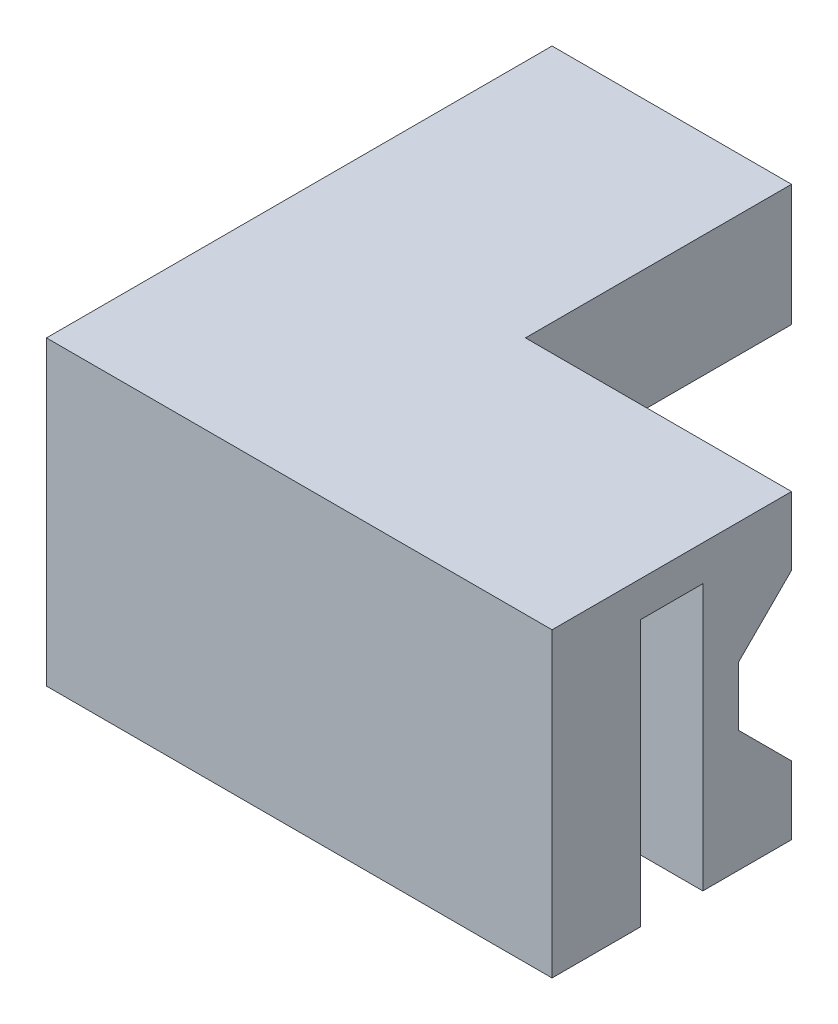
ISO-10303-21;
HEADER;
FILE_DESCRIPTION(('STEP AP214'),'2;1');
FILE_NAME('part.step','',(''),(''),'','','');
FILE_SCHEMA(('AUTOMOTIVE_DESIGN { 1 0 10303 214 1 1 1 1 }'));
ENDSEC;
DATA;
#1=APPLICATION_CONTEXT('core data for automotive mechanical design processes');
#2=APPLICATION_PROTOCOL_DEFINITION('international standard','automotive_design',2000,#1);
#3=PRODUCT_CONTEXT('',#1,'mechanical');
#4=PRODUCT('Part','Part','',(#3));
#5=PRODUCT_RELATED_PRODUCT_CATEGORY('part','',(#4));
#6=PRODUCT_DEFINITION_FORMATION('','',#4);
#7=PRODUCT_DEFINITION_CONTEXT('part definition',#1,'design');
#8=PRODUCT_DEFINITION('design','',#6,#7);
#9=PRODUCT_DEFINITION_SHAPE('','',#8);
#10=(LENGTH_UNIT() NAMED_UNIT(*) SI_UNIT(.MILLI.,.METRE.));
#11=(NAMED_UNIT(*) PLANE_ANGLE_UNIT() SI_UNIT($,.RADIAN.));
#12=(NAMED_UNIT(*) SI_UNIT($,.STERADIAN.) SOLID_ANGLE_UNIT());
#13=UNCERTAINTY_MEASURE_WITH_UNIT(LENGTH_MEASURE(1.E-05),#10,'distance_accuracy_value','');
#14=(GEOMETRIC_REPRESENTATION_CONTEXT(3) GLOBAL_UNCERTAINTY_ASSIGNED_CONTEXT((#13)) GLOBAL_UNIT_ASSIGNED_CONTEXT((#10,
#11,#12)) REPRESENTATION_CONTEXT('',''));
#15=CARTESIAN_POINT('',(0.,0.,0.));
#16=DIRECTION('',(0.,0.,1.));
#17=DIRECTION('',(1.,0.,0.));
#18=AXIS2_PLACEMENT_3D('',#15,#16,#17);
#19=CARTESIAN_POINT('',(-30.,0.,0.));
#20=DIRECTION('',(0.,-1.,0.));
#21=DIRECTION('',(0.,0.,-1.));
#22=AXIS2_PLACEMENT_3D('',#19,#20,#21);
#23=PLANE('',#22);
#24=DIRECTION('',(0.,0.,-1.));
#25=VECTOR('',#24,1.);
#26=CARTESIAN_POINT('',(-48.5,0.,-18.5));
#27=LINE('',#26,#25);
#28=CARTESIAN_POINT('',(-48.5,0.,0.));
#29=VERTEX_POINT('',#28);
#30=CARTESIAN_POINT('',(-48.5,0.,-23.5));
#31=VERTEX_POINT('',#30);
#32=EDGE_CURVE('E257',#29,#31,#27,.T.);
#33=ORIENTED_EDGE('',*,*,#32,.F.);
#34=DIRECTION('',(-1.,0.,0.));
#35=VECTOR('',#34,1.);
#36=CARTESIAN_POINT('',(-48.5,0.,0.));
#37=LINE('',#36,#35);
#38=CARTESIAN_POINT('',(-25.,0.,0.));
#39=VERTEX_POINT('',#38);
#40=EDGE_CURVE('E237',#39,#29,#37,.T.);
#41=ORIENTED_EDGE('',*,*,#40,.F.);
#42=DIRECTION('',(0.,0.,1.));
#43=VECTOR('',#42,1.);
#44=CARTESIAN_POINT('',(-25.,0.,5.));
#45=LINE('',#44,#43);
#46=CARTESIAN_POINT('',(-25.,0.,5.));
#47=VERTEX_POINT('',#46);
#48=EDGE_CURVE('E274',#39,#47,#45,.T.);
#49=ORIENTED_EDGE('',*,*,#48,.T.);
#50=DIRECTION('',(-1.,0.,0.));
#51=VECTOR('',#50,1.);
#52=CARTESIAN_POINT('',(-53.5,0.,5.));
#53=LINE('',#52,#51);
#54=CARTESIAN_POINT('',(-53.5,0.,5.));
#55=VERTEX_POINT('',#54);
#56=EDGE_CURVE('E278',#47,#55,#53,.T.);
#57=ORIENTED_EDGE('',*,*,#56,.T.);
#58=DIRECTION('',(0.,0.,-1.));
#59=VECTOR('',#58,1.);
#60=CARTESIAN_POINT('',(-53.5,0.,-23.5));
#61=LINE('',#60,#59);
#62=CARTESIAN_POINT('',(-53.5,0.,-23.5));
#63=VERTEX_POINT('',#62);
#64=EDGE_CURVE('E282',#55,#63,#61,.T.);
#65=ORIENTED_EDGE('',*,*,#64,.T.);
#66=DIRECTION('',(1.,0.,0.));
#67=VECTOR('',#66,1.);
#68=CARTESIAN_POINT('',(-40.,0.,-23.5));
#69=LINE('',#68,#67);
#70=EDGE_CURVE('E286',#63,#31,#69,.T.);
#71=ORIENTED_EDGE('',*,*,#70,.T.);
#72=EDGE_LOOP('',(#33,#41,#49,#57,#65,#71));
#73=FACE_BOUND('',#72,.T.);
#74=ADVANCED_FACE('F42',(#73),#23,.T.);
#75=CARTESIAN_POINT('',(-25.,15.,-8.5));
#76=DIRECTION('',(0.,0.,1.));
#77=DIRECTION('',(-1.,0.,0.));
#78=AXIS2_PLACEMENT_3D('',#75,#76,#77);
#79=PLANE('',#78);
#80=DIRECTION('',(0.,-1.,0.));
#81=VECTOR('',#80,1.);
#82=CARTESIAN_POINT('',(-40.,15.,-8.5));
#83=LINE('',#82,#81);
#84=CARTESIAN_POINT('',(-40.,17.,-8.5));
#85=VERTEX_POINT('',#84);
#86=CARTESIAN_POINT('',(-40.,13.15,-8.5));
#87=VERTEX_POINT('',#86);
#88=EDGE_CURVE('E186',#85,#87,#83,.T.);
#89=ORIENTED_EDGE('',*,*,#88,.F.);
#90=DIRECTION('',(1.,0.,0.));
#91=VECTOR('',#90,1.);
#92=CARTESIAN_POINT('',(-25.,17.,-8.5));
#93=LINE('',#92,#91);
#94=CARTESIAN_POINT('',(-25.,17.,-8.5));
#95=VERTEX_POINT('',#94);
#96=EDGE_CURVE('E353',#85,#95,#93,.T.);
#97=ORIENTED_EDGE('',*,*,#96,.T.);
#98=DIRECTION('',(0.,-1.,0.));
#99=VECTOR('',#98,1.);
#100=CARTESIAN_POINT('',(-25.,15.,-8.5));
#101=LINE('',#100,#99);
#102=CARTESIAN_POINT('',(-25.,13.15,-8.5));
#103=VERTEX_POINT('',#102);
#104=EDGE_CURVE('E192',#95,#103,#101,.T.);
#105=ORIENTED_EDGE('',*,*,#104,.T.);
#106=DIRECTION('',(1.,0.,0.));
#107=VECTOR('',#106,1.);
#108=CARTESIAN_POINT('',(-25.,13.15,-8.5));
#109=LINE('',#108,#107);
#110=EDGE_CURVE('E214',#87,#103,#109,.T.);
#111=ORIENTED_EDGE('',*,*,#110,.F.);
#112=EDGE_LOOP('',(#89,#97,#105,#111));
#113=FACE_BOUND('',#112,.T.);
#114=ADVANCED_FACE('F392',(#113),#79,.F.);
#115=DIRECTION('',(1.,0.,0.));
#116=VECTOR('',#115,1.);
#117=CARTESIAN_POINT('',(-25.,0.,-8.5));
#118=LINE('',#117,#116);
#119=CARTESIAN_POINT('',(-45.,0.,-8.5));
#120=VERTEX_POINT('',#119);
#121=CARTESIAN_POINT('',(-25.,0.,-8.5));
#122=VERTEX_POINT('',#121);
#123=EDGE_CURVE('E245',#120,#122,#118,.T.);
#124=ORIENTED_EDGE('',*,*,#123,.T.);
#125=CARTESIAN_POINT('',(-25.,0.,-3.5));
#126=VERTEX_POINT('',#125);
#127=EDGE_CURVE('E275',#122,#126,#45,.T.);
#128=ORIENTED_EDGE('',*,*,#127,.T.);
#129=DIRECTION('',(1.,0.,0.));
#130=VECTOR('',#129,1.);
#131=CARTESIAN_POINT('',(-30.,0.,-3.5));
#132=LINE('',#131,#130);
#133=CARTESIAN_POINT('',(-45.,0.,-3.5));
#134=VERTEX_POINT('',#133);
#135=EDGE_CURVE('E255',#134,#126,#132,.T.);
#136=ORIENTED_EDGE('',*,*,#135,.F.);
#137=DIRECTION('',(0.,0.,1.));
#138=VECTOR('',#137,1.);
#139=CARTESIAN_POINT('',(-45.,0.,-3.5));
#140=LINE('',#139,#138);
#141=EDGE_CURVE('E249',#120,#134,#140,.T.);
#142=ORIENTED_EDGE('',*,*,#141,.F.);
#143=EDGE_LOOP('',(#124,#128,#136,#142));
#144=FACE_BOUND('',#143,.T.);
#145=ADVANCED_FACE('F252',(#144),#23,.T.);
#146=CARTESIAN_POINT('',(-25.,15.,5.));
#147=DIRECTION('',(-1.,0.,0.));
#148=DIRECTION('',(0.,0.,-1.));
#149=AXIS2_PLACEMENT_3D('',#146,#147,#148);
#150=PLANE('',#149);
#151=ORIENTED_EDGE('',*,*,#127,.F.);
#152=CARTESIAN_POINT('',(-25.,3.84999999999998,-8.5));
#153=VERTEX_POINT('',#152);
#154=EDGE_CURVE('E291',#153,#122,#101,.T.);
#155=ORIENTED_EDGE('',*,*,#154,.F.);
#156=DIRECTION('',(0.,0.707106781186548,0.707106781186547));
#157=VECTOR('',#156,1.);
#158=CARTESIAN_POINT('',(-25.,6.85,-5.49999999999999));
#159=LINE('',#158,#157);
#160=CARTESIAN_POINT('',(-25.,6.85,-5.5));
#161=VERTEX_POINT('',#160);
#162=EDGE_CURVE('E209',#161,#153,#159,.F.);
#163=ORIENTED_EDGE('',*,*,#162,.F.);
#164=DIRECTION('',(0.,-1.,0.));
#165=VECTOR('',#164,1.);
#166=CARTESIAN_POINT('',(-25.,15.,-5.5));
#167=LINE('',#166,#165);
#168=CARTESIAN_POINT('',(-25.,10.15,-5.5));
#169=VERTEX_POINT('',#168);
#170=EDGE_CURVE('E201',#169,#161,#167,.T.);
#171=ORIENTED_EDGE('',*,*,#170,.F.);
#172=DIRECTION('',(0.,0.707106781186547,-0.707106781186548));
#173=VECTOR('',#172,1.);
#174=CARTESIAN_POINT('',(-25.,13.15,-8.5));
#175=LINE('',#174,#173);
#176=EDGE_CURVE('E205',#103,#169,#175,.F.);
#177=ORIENTED_EDGE('',*,*,#176,.F.);
#178=ORIENTED_EDGE('',*,*,#104,.F.);
#179=DIRECTION('',(0.,0.,1.));
#180=VECTOR('',#179,1.);
#181=CARTESIAN_POINT('',(-25.,17.,5.));
#182=LINE('',#181,#180);
#183=CARTESIAN_POINT('',(-25.,17.,5.));
#184=VERTEX_POINT('',#183);
#185=EDGE_CURVE('E326',#95,#184,#182,.T.);
#186=ORIENTED_EDGE('',*,*,#185,.T.);
#187=DIRECTION('',(0.,-1.,0.));
#188=VECTOR('',#187,1.);
#189=CARTESIAN_POINT('',(-25.,15.,5.));
#190=LINE('',#189,#188);
#191=EDGE_CURVE('E198',#184,#47,#190,.T.);
#192=ORIENTED_EDGE('',*,*,#191,.T.);
#193=ORIENTED_EDGE('',*,*,#48,.F.);
#194=DIRECTION('',(0.,-1.,0.));
#195=VECTOR('',#194,1.);
#196=CARTESIAN_POINT('',(-25.,48.8222720909679,0.));
#197=LINE('',#196,#195);
#198=CARTESIAN_POINT('',(-25.,15.,0.));
#199=VERTEX_POINT('',#198);
#200=EDGE_CURVE('E309',#199,#39,#197,.T.);
#201=ORIENTED_EDGE('',*,*,#200,.F.);
#202=DIRECTION('',(0.,0.,1.));
#203=VECTOR('',#202,1.);
#204=CARTESIAN_POINT('',(-25.,15.,0.));
#205=LINE('',#204,#203);
#206=CARTESIAN_POINT('',(-25.,15.,-3.5));
#207=VERTEX_POINT('',#206);
#208=EDGE_CURVE('E306',#207,#199,#205,.T.);
#209=ORIENTED_EDGE('',*,*,#208,.F.);
#210=DIRECTION('',(0.,-1.,0.));
#211=VECTOR('',#210,1.);
#212=CARTESIAN_POINT('',(-25.,48.8222720909679,-3.5));
#213=LINE('',#212,#211);
#214=EDGE_CURVE('E303',#207,#126,#213,.T.);
#215=ORIENTED_EDGE('',*,*,#214,.T.);
#216=EDGE_LOOP('',(#151,#155,#163,#171,#177,#178,#186,#192,#193,#201,#209,#215));
#217=FACE_BOUND('',#216,.T.);
#218=ADVANCED_FACE('F300',(#217),#150,.F.);
#219=CARTESIAN_POINT('',(-53.5,15.,5.));
#220=DIRECTION('',(0.,0.,-1.));
#221=DIRECTION('',(1.,0.,0.));
#222=AXIS2_PLACEMENT_3D('',#219,#220,#221);
#223=PLANE('',#222);
#224=ORIENTED_EDGE('',*,*,#56,.F.);
#225=ORIENTED_EDGE('',*,*,#191,.F.);
#226=DIRECTION('',(-1.,0.,0.));
#227=VECTOR('',#226,1.);
#228=CARTESIAN_POINT('',(-53.5,17.,5.));
#229=LINE('',#228,#227);
#230=CARTESIAN_POINT('',(-53.5,17.,5.));
#231=VERTEX_POINT('',#230);
#232=EDGE_CURVE('E340',#184,#231,#229,.T.);
#233=ORIENTED_EDGE('',*,*,#232,.T.);
#234=DIRECTION('',(0.,-1.,0.));
#235=VECTOR('',#234,1.);
#236=CARTESIAN_POINT('',(-53.5,15.,5.));
#237=LINE('',#236,#235);
#238=EDGE_CURVE('E190',#231,#55,#237,.T.);
#239=ORIENTED_EDGE('',*,*,#238,.T.);
#240=EDGE_LOOP('',(#224,#225,#233,#239));
#241=FACE_BOUND('',#240,.T.);
#242=ADVANCED_FACE('F384',(#241),#223,.F.);
#243=CARTESIAN_POINT('',(-53.5,15.,-23.5));
#244=DIRECTION('',(1.,0.,0.));
#245=DIRECTION('',(0.,0.,1.));
#246=AXIS2_PLACEMENT_3D('',#243,#244,#245);
#247=PLANE('',#246);
#248=ORIENTED_EDGE('',*,*,#64,.F.);
#249=ORIENTED_EDGE('',*,*,#238,.F.);
#250=DIRECTION('',(0.,0.,-1.));
#251=VECTOR('',#250,1.);
#252=CARTESIAN_POINT('',(-53.5,17.,-23.5));
#253=LINE('',#252,#251);
#254=CARTESIAN_POINT('',(-53.5,17.,-23.5));
#255=VERTEX_POINT('',#254);
#256=EDGE_CURVE('E344',#231,#255,#253,.T.);
#257=ORIENTED_EDGE('',*,*,#256,.T.);
#258=DIRECTION('',(0.,-1.,0.));
#259=VECTOR('',#258,1.);
#260=CARTESIAN_POINT('',(-53.5,15.,-23.5));
#261=LINE('',#260,#259);
#262=EDGE_CURVE('E185',#255,#63,#261,.T.);
#263=ORIENTED_EDGE('',*,*,#262,.T.);
#264=EDGE_LOOP('',(#248,#249,#257,#263));
#265=FACE_BOUND('',#264,.T.);
#266=ADVANCED_FACE('F387',(#265),#247,.F.);
#267=CARTESIAN_POINT('',(-40.,15.,-23.5));
#268=DIRECTION('',(0.,0.,1.));
#269=DIRECTION('',(-1.,0.,0.));
#270=AXIS2_PLACEMENT_3D('',#267,#268,#269);
#271=PLANE('',#270);
#272=DIRECTION('',(0.,-1.,0.));
#273=VECTOR('',#272,1.);
#274=CARTESIAN_POINT('',(-45.,15.,-23.5));
#275=LINE('',#274,#273);
#276=CARTESIAN_POINT('',(-45.,15.,-23.5));
#277=VERTEX_POINT('',#276);
#278=CARTESIAN_POINT('',(-45.,10.15,-23.5));
#279=VERTEX_POINT('',#278);
#280=EDGE_CURVE('E315',#277,#279,#275,.T.);
#281=ORIENTED_EDGE('',*,*,#280,.F.);
#282=DIRECTION('',(-1.,0.,0.));
#283=VECTOR('',#282,1.);
#284=CARTESIAN_POINT('',(-40.,15.,-23.5));
#285=LINE('',#284,#283);
#286=CARTESIAN_POINT('',(-48.5,15.,-23.5));
#287=VERTEX_POINT('',#286);
#288=EDGE_CURVE('E321',#277,#287,#285,.T.);
#289=ORIENTED_EDGE('',*,*,#288,.T.);
#290=DIRECTION('',(0.,1.,0.));
#291=VECTOR('',#290,1.);
#292=CARTESIAN_POINT('',(-48.5,15.,-23.5));
#293=LINE('',#292,#291);
#294=EDGE_CURVE('E327',#31,#287,#293,.T.);
#295=ORIENTED_EDGE('',*,*,#294,.F.);
#296=ORIENTED_EDGE('',*,*,#70,.F.);
#297=ORIENTED_EDGE('',*,*,#262,.F.);
#298=DIRECTION('',(1.,0.,0.));
#299=VECTOR('',#298,1.);
#300=CARTESIAN_POINT('',(-40.,17.,-23.5));
#301=LINE('',#300,#299);
#302=CARTESIAN_POINT('',(-40.,17.,-23.5));
#303=VERTEX_POINT('',#302);
#304=EDGE_CURVE('E183',#255,#303,#301,.T.);
#305=ORIENTED_EDGE('',*,*,#304,.T.);
#306=DIRECTION('',(0.,-1.,0.));
#307=VECTOR('',#306,1.);
#308=CARTESIAN_POINT('',(-40.,15.,-23.5));
#309=LINE('',#308,#307);
#310=CARTESIAN_POINT('',(-40.,10.15,-23.5));
#311=VERTEX_POINT('',#310);
#312=EDGE_CURVE('E166',#303,#311,#309,.T.);
#313=ORIENTED_EDGE('',*,*,#312,.T.);
#314=DIRECTION('',(1.,0.,0.));
#315=VECTOR('',#314,1.);
#316=CARTESIAN_POINT('',(-69.1645227382584,10.15,-23.5));
#317=LINE('',#316,#315);
#318=EDGE_CURVE('E171',#279,#311,#317,.T.);
#319=ORIENTED_EDGE('',*,*,#318,.F.);
#320=EDGE_LOOP('',(#281,#289,#295,#296,#297,#305,#313,#319));
#321=FACE_BOUND('',#320,.T.);
#322=ADVANCED_FACE('F181',(#321),#271,.F.);
#323=CARTESIAN_POINT('',(-40.,15.,-8.5));
#324=DIRECTION('',(-1.,0.,0.));
#325=DIRECTION('',(0.,0.,-1.));
#326=AXIS2_PLACEMENT_3D('',#323,#324,#325);
#327=PLANE('',#326);
#328=ORIENTED_EDGE('',*,*,#312,.F.);
#329=DIRECTION('',(0.,0.,1.));
#330=VECTOR('',#329,1.);
#331=CARTESIAN_POINT('',(-40.,17.,-8.5));
#332=LINE('',#331,#330);
#333=EDGE_CURVE('E350',#303,#85,#332,.T.);
#334=ORIENTED_EDGE('',*,*,#333,.T.);
#335=ORIENTED_EDGE('',*,*,#88,.T.);
#336=DIRECTION('',(0.,-0.707106781186547,0.707106781186548));
#337=VECTOR('',#336,1.);
#338=CARTESIAN_POINT('',(-40.,14.075,-9.425));
#339=LINE('',#338,#337);
#340=CARTESIAN_POINT('',(-40.,10.15,-5.5));
#341=VERTEX_POINT('',#340);
#342=EDGE_CURVE('E58',#341,#87,#339,.F.);
#343=ORIENTED_EDGE('',*,*,#342,.F.);
#344=DIRECTION('',(0.,0.,-1.));
#345=VECTOR('',#344,1.);
#346=CARTESIAN_POINT('',(-40.,10.15,-23.5));
#347=LINE('',#346,#345);
#348=EDGE_CURVE('E162',#341,#311,#347,.T.);
#349=ORIENTED_EDGE('',*,*,#348,.T.);
#350=EDGE_LOOP('',(#328,#334,#335,#343,#349));
#351=FACE_BOUND('',#350,.T.);
#352=ADVANCED_FACE('F164',(#351),#327,.F.);
#353=ORIENTED_EDGE('',*,*,#154,.T.);
#354=ORIENTED_EDGE('',*,*,#123,.F.);
#355=DIRECTION('',(0.,-1.,0.));
#356=VECTOR('',#355,1.);
#357=CARTESIAN_POINT('',(-45.,15.,-8.5));
#358=LINE('',#357,#356);
#359=CARTESIAN_POINT('',(-45.,3.84999999999998,-8.5));
#360=VERTEX_POINT('',#359);
#361=EDGE_CURVE('E219',#360,#120,#358,.T.);
#362=ORIENTED_EDGE('',*,*,#361,.F.);
#363=DIRECTION('',(-1.,0.,0.));
#364=VECTOR('',#363,1.);
#365=CARTESIAN_POINT('',(-25.,3.84999999999998,-8.5));
#366=LINE('',#365,#364);
#367=EDGE_CURVE('E66',#153,#360,#366,.T.);
#368=ORIENTED_EDGE('',*,*,#367,.F.);
#369=EDGE_LOOP('',(#353,#354,#362,#368));
#370=FACE_BOUND('',#369,.T.);
#371=ADVANCED_FACE('F243',(#370),#79,.F.);
#372=CARTESIAN_POINT('',(-48.5,15.,0.));
#373=DIRECTION('',(0.,0.,-1.));
#374=DIRECTION('',(1.,0.,0.));
#375=AXIS2_PLACEMENT_3D('',#372,#373,#374);
#376=PLANE('',#375);
#377=ORIENTED_EDGE('',*,*,#40,.T.);
#378=DIRECTION('',(0.,-1.,0.));
#379=VECTOR('',#378,1.);
#380=CARTESIAN_POINT('',(-48.5,15.,0.));
#381=LINE('',#380,#379);
#382=CARTESIAN_POINT('',(-48.5,15.,0.));
#383=VERTEX_POINT('',#382);
#384=EDGE_CURVE('E270',#383,#29,#381,.T.);
#385=ORIENTED_EDGE('',*,*,#384,.F.);
#386=DIRECTION('',(-1.,0.,0.));
#387=VECTOR('',#386,1.);
#388=CARTESIAN_POINT('',(-48.5,15.,0.));
#389=LINE('',#388,#387);
#390=EDGE_CURVE('E261',#199,#383,#389,.T.);
#391=ORIENTED_EDGE('',*,*,#390,.F.);
#392=ORIENTED_EDGE('',*,*,#200,.T.);
#393=EDGE_LOOP('',(#377,#385,#391,#392));
#394=FACE_BOUND('',#393,.T.);
#395=ADVANCED_FACE('F369',(#394),#376,.T.);
#396=CARTESIAN_POINT('',(-48.5,15.,-18.5));
#397=DIRECTION('',(1.,0.,0.));
#398=DIRECTION('',(0.,0.,1.));
#399=AXIS2_PLACEMENT_3D('',#396,#397,#398);
#400=PLANE('',#399);
#401=DIRECTION('',(0.,0.,-1.));
#402=VECTOR('',#401,1.);
#403=CARTESIAN_POINT('',(-48.5,15.,-18.5));
#404=LINE('',#403,#402);
#405=EDGE_CURVE('E318',#383,#287,#404,.T.);
#406=ORIENTED_EDGE('',*,*,#405,.F.);
#407=ORIENTED_EDGE('',*,*,#384,.T.);
#408=ORIENTED_EDGE('',*,*,#32,.T.);
#409=ORIENTED_EDGE('',*,*,#294,.T.);
#410=EDGE_LOOP('',(#406,#407,#408,#409));
#411=FACE_BOUND('',#410,.T.);
#412=ADVANCED_FACE('F375',(#411),#400,.T.);
#413=CARTESIAN_POINT('',(-45.,15.,-3.5));
#414=DIRECTION('',(-1.,0.,0.));
#415=DIRECTION('',(0.,0.,-1.));
#416=AXIS2_PLACEMENT_3D('',#413,#414,#415);
#417=PLANE('',#416);
#418=DIRECTION('',(0.,0.,1.));
#419=VECTOR('',#418,1.);
#420=CARTESIAN_POINT('',(-45.,10.15,-3.5));
#421=LINE('',#420,#419);
#422=CARTESIAN_POINT('',(-45.,10.15,-5.5));
#423=VERTEX_POINT('',#422);
#424=EDGE_CURVE('E12',#279,#423,#421,.T.);
#425=ORIENTED_EDGE('',*,*,#424,.T.);
#426=DIRECTION('',(0.,-1.,0.));
#427=VECTOR('',#426,1.);
#428=CARTESIAN_POINT('',(-45.,15.,-5.5));
#429=LINE('',#428,#427);
#430=CARTESIAN_POINT('',(-45.,6.85,-5.5));
#431=VERTEX_POINT('',#430);
#432=EDGE_CURVE('E51',#423,#431,#429,.T.);
#433=ORIENTED_EDGE('',*,*,#432,.T.);
#434=DIRECTION('',(0.,-0.707106781186549,-0.707106781186546));
#435=VECTOR('',#434,1.);
#436=CARTESIAN_POINT('',(-45.,11.925,-0.425000000000003));
#437=LINE('',#436,#435);
#438=EDGE_CURVE('E222',#431,#360,#437,.T.);
#439=ORIENTED_EDGE('',*,*,#438,.T.);
#440=ORIENTED_EDGE('',*,*,#361,.T.);
#441=ORIENTED_EDGE('',*,*,#141,.T.);
#442=DIRECTION('',(0.,-1.,0.));
#443=VECTOR('',#442,1.);
#444=CARTESIAN_POINT('',(-45.,15.,-3.5));
#445=LINE('',#444,#443);
#446=CARTESIAN_POINT('',(-45.,15.,-3.5));
#447=VERTEX_POINT('',#446);
#448=EDGE_CURVE('E267',#447,#134,#445,.T.);
#449=ORIENTED_EDGE('',*,*,#448,.F.);
#450=DIRECTION('',(0.,0.,1.));
#451=VECTOR('',#450,1.);
#452=CARTESIAN_POINT('',(-45.,15.,-3.5));
#453=LINE('',#452,#451);
#454=EDGE_CURVE('E313',#277,#447,#453,.T.);
#455=ORIENTED_EDGE('',*,*,#454,.F.);
#456=ORIENTED_EDGE('',*,*,#280,.T.);
#457=EDGE_LOOP('',(#425,#433,#439,#440,#441,#449,#455,#456));
#458=FACE_BOUND('',#457,.T.);
#459=ADVANCED_FACE('F228',(#458),#417,.T.);
#460=CARTESIAN_POINT('',(-30.,15.,-3.5));
#461=DIRECTION('',(0.,0.,1.));
#462=DIRECTION('',(-1.,0.,0.));
#463=AXIS2_PLACEMENT_3D('',#460,#461,#462);
#464=PLANE('',#463);
#465=ORIENTED_EDGE('',*,*,#135,.T.);
#466=ORIENTED_EDGE('',*,*,#214,.F.);
#467=DIRECTION('',(1.,0.,0.));
#468=VECTOR('',#467,1.);
#469=CARTESIAN_POINT('',(-30.,15.,-3.5));
#470=LINE('',#469,#468);
#471=EDGE_CURVE('E271',#447,#207,#470,.T.);
#472=ORIENTED_EDGE('',*,*,#471,.F.);
#473=ORIENTED_EDGE('',*,*,#448,.T.);
#474=EDGE_LOOP('',(#465,#466,#472,#473));
#475=FACE_BOUND('',#474,.T.);
#476=ADVANCED_FACE('F311',(#475),#464,.T.);
#477=CARTESIAN_POINT('',(-30.,15.,-5.5));
#478=DIRECTION('',(0.,0.,1.));
#479=DIRECTION('',(-1.,0.,0.));
#480=AXIS2_PLACEMENT_3D('',#477,#478,#479);
#481=PLANE('',#480);
#482=DIRECTION('',(-1.,0.,0.));
#483=VECTOR('',#482,1.);
#484=CARTESIAN_POINT('',(-20.8601805163073,10.15,-5.5));
#485=LINE('',#484,#483);
#486=EDGE_CURVE('E238',#169,#341,#485,.T.);
#487=ORIENTED_EDGE('',*,*,#486,.F.);
#488=ORIENTED_EDGE('',*,*,#170,.T.);
#489=DIRECTION('',(1.,0.,0.));
#490=VECTOR('',#489,1.);
#491=CARTESIAN_POINT('',(-20.8601805163073,6.85,-5.5));
#492=LINE('',#491,#490);
#493=EDGE_CURVE('E232',#431,#161,#492,.T.);
#494=ORIENTED_EDGE('',*,*,#493,.F.);
#495=ORIENTED_EDGE('',*,*,#432,.F.);
#496=DIRECTION('',(1.,0.,0.));
#497=VECTOR('',#496,1.);
#498=CARTESIAN_POINT('',(-69.1645227382584,10.15,-5.5));
#499=LINE('',#498,#497);
#500=EDGE_CURVE('E179',#423,#341,#499,.T.);
#501=ORIENTED_EDGE('',*,*,#500,.T.);
#502=EDGE_LOOP('',(#487,#488,#494,#495,#501));
#503=FACE_BOUND('',#502,.T.);
#504=ADVANCED_FACE('F231',(#503),#481,.F.);
#505=CARTESIAN_POINT('',(-20.8601805163073,6.85,-5.49999999999999));
#506=DIRECTION('',(0.,-0.707106781186547,0.707106781186548));
#507=DIRECTION('',(1.,0.,0.));
#508=AXIS2_PLACEMENT_3D('',#505,#506,#507);
#509=PLANE('',#508);
#510=ORIENTED_EDGE('',*,*,#493,.T.);
#511=ORIENTED_EDGE('',*,*,#162,.T.);
#512=ORIENTED_EDGE('',*,*,#367,.T.);
#513=ORIENTED_EDGE('',*,*,#438,.F.);
#514=EDGE_LOOP('',(#510,#511,#512,#513));
#515=FACE_BOUND('',#514,.T.);
#516=ADVANCED_FACE('F240',(#515),#509,.F.);
#517=CARTESIAN_POINT('',(-25.,13.15,-8.5));
#518=DIRECTION('',(0.,0.707106781186548,0.707106781186547));
#519=DIRECTION('',(1.,0.,0.));
#520=AXIS2_PLACEMENT_3D('',#517,#518,#519);
#521=PLANE('',#520);
#522=ORIENTED_EDGE('',*,*,#342,.T.);
#523=ORIENTED_EDGE('',*,*,#110,.T.);
#524=ORIENTED_EDGE('',*,*,#176,.T.);
#525=ORIENTED_EDGE('',*,*,#486,.T.);
#526=EDGE_LOOP('',(#522,#523,#524,#525));
#527=FACE_BOUND('',#526,.T.);
#528=ADVANCED_FACE('F44',(#527),#521,.F.);
#529=CARTESIAN_POINT('',(-30.,15.,0.));
#530=DIRECTION('',(0.,-1.,0.));
#531=DIRECTION('',(0.,0.,-1.));
#532=AXIS2_PLACEMENT_3D('',#529,#530,#531);
#533=PLANE('',#532);
#534=ORIENTED_EDGE('',*,*,#390,.T.);
#535=ORIENTED_EDGE('',*,*,#405,.T.);
#536=ORIENTED_EDGE('',*,*,#288,.F.);
#537=ORIENTED_EDGE('',*,*,#454,.T.);
#538=ORIENTED_EDGE('',*,*,#471,.T.);
#539=ORIENTED_EDGE('',*,*,#208,.T.);
#540=EDGE_LOOP('',(#534,#535,#536,#537,#538,#539));
#541=FACE_BOUND('',#540,.T.);
#542=ADVANCED_FACE('F323',(#541),#533,.T.);
#543=CARTESIAN_POINT('',(-30.,17.,0.));
#544=DIRECTION('',(0.,-1.,0.));
#545=DIRECTION('',(0.,0.,-1.));
#546=AXIS2_PLACEMENT_3D('',#543,#544,#545);
#547=PLANE('',#546);
#548=ORIENTED_EDGE('',*,*,#185,.F.);
#549=ORIENTED_EDGE('',*,*,#96,.F.);
#550=ORIENTED_EDGE('',*,*,#333,.F.);
#551=ORIENTED_EDGE('',*,*,#304,.F.);
#552=ORIENTED_EDGE('',*,*,#256,.F.);
#553=ORIENTED_EDGE('',*,*,#232,.F.);
#554=EDGE_LOOP('',(#548,#549,#550,#551,#552,#553));
#555=FACE_BOUND('',#554,.T.);
#556=ADVANCED_FACE('F389',(#555),#547,.F.);
#557=CARTESIAN_POINT('',(-69.1645227382584,10.15,-23.5));
#558=DIRECTION('',(0.,1.,0.));
#559=DIRECTION('',(0.,0.,1.));
#560=AXIS2_PLACEMENT_3D('',#557,#558,#559);
#561=PLANE('',#560);
#562=ORIENTED_EDGE('',*,*,#424,.F.);
#563=ORIENTED_EDGE('',*,*,#318,.T.);
#564=ORIENTED_EDGE('',*,*,#348,.F.);
#565=ORIENTED_EDGE('',*,*,#500,.F.);
#566=EDGE_LOOP('',(#562,#563,#564,#565));
#567=FACE_BOUND('',#566,.T.);
#568=ADVANCED_FACE('F174',(#567),#561,.F.);
#569=CLOSED_SHELL('',(#74,#114,#145,#218,#242,#266,#322,#352,#371,#395,#412,#459,#476,#504,#516,
#528,#542,#556,#568));
#570=MANIFOLD_SOLID_BREP('B2',#569);
#571=ADVANCED_BREP_SHAPE_REPRESENTATION('',(#18,#570),#14);
#572=SHAPE_DEFINITION_REPRESENTATION(#9,#571);
ENDSEC;
END-ISO-10303-21;
